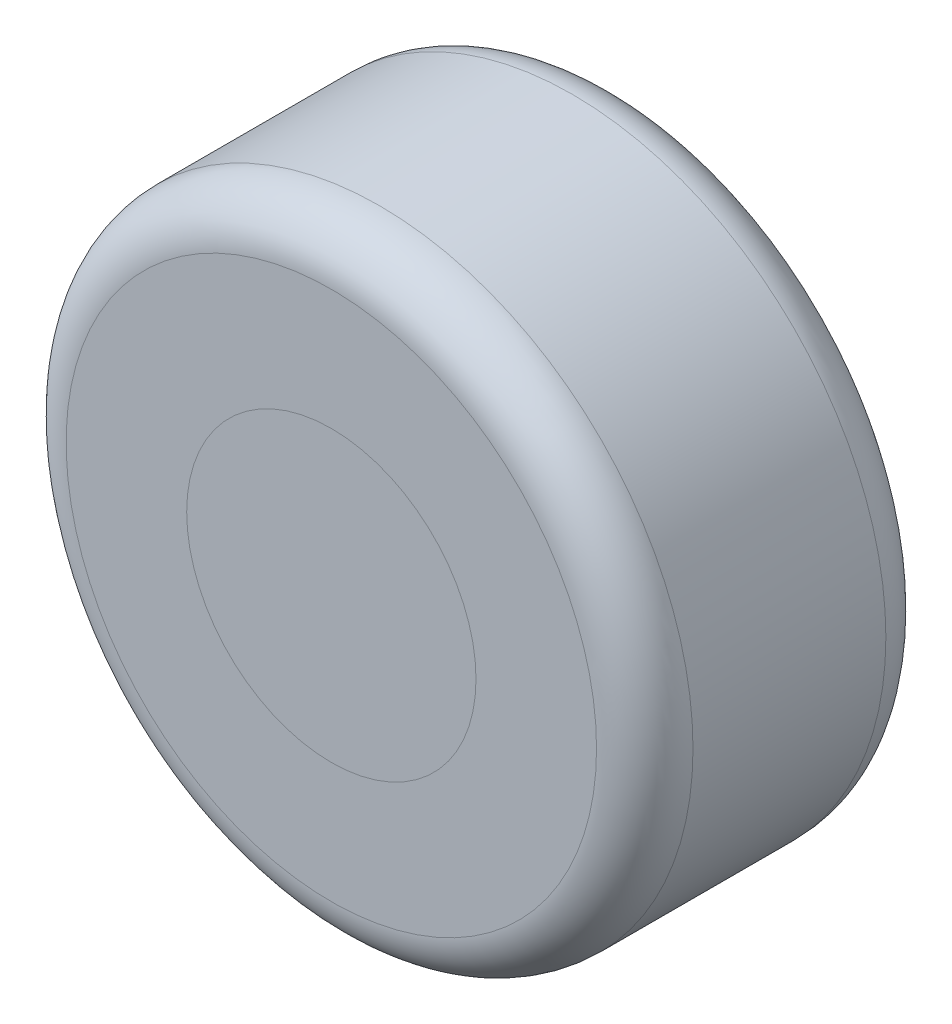
ISO-10303-21;
HEADER;
FILE_DESCRIPTION(('STEP AP214'),'2;1');
FILE_NAME('part.step','',(''),(''),'','','');
FILE_SCHEMA(('AUTOMOTIVE_DESIGN { 1 0 10303 214 1 1 1 1 }'));
ENDSEC;
DATA;
#1=APPLICATION_CONTEXT('core data for automotive mechanical design processes');
#2=APPLICATION_PROTOCOL_DEFINITION('international standard','automotive_design',2000,#1);
#3=PRODUCT_CONTEXT('',#1,'mechanical');
#4=PRODUCT('Part','Part','',(#3));
#5=PRODUCT_RELATED_PRODUCT_CATEGORY('part','',(#4));
#6=PRODUCT_DEFINITION_FORMATION('','',#4);
#7=PRODUCT_DEFINITION_CONTEXT('part definition',#1,'design');
#8=PRODUCT_DEFINITION('design','',#6,#7);
#9=PRODUCT_DEFINITION_SHAPE('','',#8);
#10=(LENGTH_UNIT() NAMED_UNIT(*) SI_UNIT(.MILLI.,.METRE.));
#11=(NAMED_UNIT(*) PLANE_ANGLE_UNIT() SI_UNIT($,.RADIAN.));
#12=(NAMED_UNIT(*) SI_UNIT($,.STERADIAN.) SOLID_ANGLE_UNIT());
#13=UNCERTAINTY_MEASURE_WITH_UNIT(LENGTH_MEASURE(1.E-05),#10,'distance_accuracy_value','');
#14=(GEOMETRIC_REPRESENTATION_CONTEXT(3) GLOBAL_UNCERTAINTY_ASSIGNED_CONTEXT((#13)) GLOBAL_UNIT_ASSIGNED_CONTEXT((#10,
#11,#12)) REPRESENTATION_CONTEXT('',''));
#15=CARTESIAN_POINT('',(0.,0.,0.));
#16=DIRECTION('',(0.,0.,1.));
#17=DIRECTION('',(1.,0.,0.));
#18=AXIS2_PLACEMENT_3D('',#15,#16,#17);
#19=CARTESIAN_POINT('',(0.,0.,-60.));
#20=DIRECTION('',(0.,0.,1.));
#21=DIRECTION('',(1.,0.,0.));
#22=AXIS2_PLACEMENT_3D('',#19,#20,#21);
#23=CYLINDRICAL_SURFACE('',#22,30.);
#24=CARTESIAN_POINT('',(0.,0.,-60.));
#25=DIRECTION('',(0.,0.,1.));
#26=DIRECTION('',(1.,0.,0.));
#27=AXIS2_PLACEMENT_3D('',#24,#25,#26);
#28=CIRCLE('',#27,30.);
#29=CARTESIAN_POINT('',(30.,0.,-60.));
#30=VERTEX_POINT('',#29);
#31=EDGE_CURVE('E11',#30,#30,#28,.T.);
#32=ORIENTED_EDGE('',*,*,#31,.T.);
#33=EDGE_LOOP('',(#32));
#34=FACE_BOUND('',#33,.T.);
#35=CARTESIAN_POINT('',(0.,0.,0.));
#36=DIRECTION('',(0.,0.,1.));
#37=DIRECTION('',(1.,0.,0.));
#38=AXIS2_PLACEMENT_3D('',#35,#36,#37);
#39=CIRCLE('',#38,30.);
#40=CARTESIAN_POINT('',(30.,0.,0.));
#41=VERTEX_POINT('',#40);
#42=EDGE_CURVE('E50',#41,#41,#39,.T.);
#43=ORIENTED_EDGE('',*,*,#42,.F.);
#44=EDGE_LOOP('',(#43));
#45=FACE_BOUND('',#44,.T.);
#46=ADVANCED_FACE('F47',(#34,#45),#23,.T.);
#47=CARTESIAN_POINT('',(0.,0.,-60.));
#48=DIRECTION('',(0.,0.,1.));
#49=DIRECTION('',(1.,0.,0.));
#50=AXIS2_PLACEMENT_3D('',#47,#48,#49);
#51=PLANE('',#50);
#52=ORIENTED_EDGE('',*,*,#31,.F.);
#53=EDGE_LOOP('',(#52));
#54=FACE_BOUND('',#53,.T.);
#55=ADVANCED_FACE('F62',(#54),#51,.F.);
#56=CARTESIAN_POINT('',(0.,0.,0.));
#57=DIRECTION('',(0.,0.,1.));
#58=DIRECTION('',(1.,0.,0.));
#59=AXIS2_PLACEMENT_3D('',#56,#57,#58);
#60=PLANE('',#59);
#61=ORIENTED_EDGE('',*,*,#42,.T.);
#62=EDGE_LOOP('',(#61));
#63=FACE_BOUND('',#62,.T.);
#64=ADVANCED_FACE('F59',(#63),#60,.T.);
#65=CLOSED_SHELL('',(#46,#55,#64));
#66=MANIFOLD_SOLID_BREP('B2',#65);
#67=CARTESIAN_POINT('',(0.,0.,-60.));
#68=DIRECTION('',(0.,0.,1.));
#69=DIRECTION('',(1.,0.,0.));
#70=AXIS2_PLACEMENT_3D('',#67,#68,#69);
#71=CYLINDRICAL_SURFACE('',#70,65.);
#72=CARTESIAN_POINT('',(0.,0.,-50.));
#73=DIRECTION('',(0.,0.,1.));
#74=DIRECTION('',(1.,0.,0.));
#75=AXIS2_PLACEMENT_3D('',#72,#73,#74);
#76=CIRCLE('',#75,65.);
#77=CARTESIAN_POINT('',(65.,0.,-50.));
#78=VERTEX_POINT('',#77);
#79=EDGE_CURVE('E105',#78,#78,#76,.T.);
#80=ORIENTED_EDGE('',*,*,#79,.T.);
#81=EDGE_LOOP('',(#80));
#82=FACE_BOUND('',#81,.T.);
#83=CARTESIAN_POINT('',(0.,0.,-10.));
#84=DIRECTION('',(0.,0.,1.));
#85=DIRECTION('',(1.,0.,0.));
#86=AXIS2_PLACEMENT_3D('',#83,#84,#85);
#87=CIRCLE('',#86,65.);
#88=CARTESIAN_POINT('',(65.,0.,-10.));
#89=VERTEX_POINT('',#88);
#90=EDGE_CURVE('E110',#89,#89,#87,.F.);
#91=ORIENTED_EDGE('',*,*,#90,.T.);
#92=EDGE_LOOP('',(#91));
#93=FACE_BOUND('',#92,.T.);
#94=ADVANCED_FACE('F92',(#82,#93),#71,.T.);
#95=CARTESIAN_POINT('',(0.,0.,-60.));
#96=DIRECTION('',(0.,0.,1.));
#97=DIRECTION('',(1.,0.,0.));
#98=AXIS2_PLACEMENT_3D('',#95,#96,#97);
#99=PLANE('',#98);
#100=CARTESIAN_POINT('',(0.,0.,-60.));
#101=DIRECTION('',(0.,0.,1.));
#102=DIRECTION('',(1.,0.,0.));
#103=AXIS2_PLACEMENT_3D('',#100,#101,#102);
#104=CIRCLE('',#103,55.);
#105=CARTESIAN_POINT('',(55.,0.,-60.));
#106=VERTEX_POINT('',#105);
#107=EDGE_CURVE('E100',#106,#106,#104,.F.);
#108=ORIENTED_EDGE('',*,*,#107,.T.);
#109=EDGE_LOOP('',(#108));
#110=FACE_BOUND('',#109,.T.);
#111=CARTESIAN_POINT('',(0.,0.,-60.));
#112=DIRECTION('',(0.,0.,1.));
#113=DIRECTION('',(1.,0.,0.));
#114=AXIS2_PLACEMENT_3D('',#111,#112,#113);
#115=CIRCLE('',#114,30.);
#116=CARTESIAN_POINT('',(30.,0.,-60.));
#117=VERTEX_POINT('',#116);
#118=EDGE_CURVE('E116',#117,#117,#115,.T.);
#119=ORIENTED_EDGE('',*,*,#118,.T.);
#120=EDGE_LOOP('',(#119));
#121=FACE_BOUND('',#120,.T.);
#122=ADVANCED_FACE('F125',(#110,#121),#99,.F.);
#123=CARTESIAN_POINT('',(0.,0.,0.));
#124=DIRECTION('',(0.,0.,1.));
#125=DIRECTION('',(1.,0.,0.));
#126=AXIS2_PLACEMENT_3D('',#123,#124,#125);
#127=PLANE('',#126);
#128=CARTESIAN_POINT('',(0.,0.,0.));
#129=DIRECTION('',(0.,0.,1.));
#130=DIRECTION('',(1.,0.,0.));
#131=AXIS2_PLACEMENT_3D('',#128,#129,#130);
#132=CIRCLE('',#131,55.);
#133=CARTESIAN_POINT('',(55.,0.,0.));
#134=VERTEX_POINT('',#133);
#135=EDGE_CURVE('E46',#134,#134,#132,.T.);
#136=ORIENTED_EDGE('',*,*,#135,.T.);
#137=EDGE_LOOP('',(#136));
#138=FACE_BOUND('',#137,.T.);
#139=CARTESIAN_POINT('',(0.,0.,0.));
#140=DIRECTION('',(0.,0.,1.));
#141=DIRECTION('',(1.,0.,0.));
#142=AXIS2_PLACEMENT_3D('',#139,#140,#141);
#143=CIRCLE('',#142,30.);
#144=CARTESIAN_POINT('',(30.,0.,0.));
#145=VERTEX_POINT('',#144);
#146=EDGE_CURVE('E117',#145,#145,#143,.T.);
#147=ORIENTED_EDGE('',*,*,#146,.F.);
#148=EDGE_LOOP('',(#147));
#149=FACE_BOUND('',#148,.T.);
#150=ADVANCED_FACE('F131',(#138,#149),#127,.T.);
#151=CARTESIAN_POINT('',(0.,0.,-60.));
#152=DIRECTION('',(0.,0.,1.));
#153=DIRECTION('',(1.,0.,0.));
#154=AXIS2_PLACEMENT_3D('',#151,#152,#153);
#155=CYLINDRICAL_SURFACE('',#154,30.);
#156=ORIENTED_EDGE('',*,*,#118,.F.);
#157=EDGE_LOOP('',(#156));
#158=FACE_BOUND('',#157,.T.);
#159=ORIENTED_EDGE('',*,*,#146,.T.);
#160=EDGE_LOOP('',(#159));
#161=FACE_BOUND('',#160,.T.);
#162=ADVANCED_FACE('F127',(#158,#161),#155,.F.);
#163=CARTESIAN_POINT('',(0.,0.,-50.));
#164=DIRECTION('',(0.,0.,1.));
#165=DIRECTION('',(1.,0.,0.));
#166=AXIS2_PLACEMENT_3D('',#163,#164,#165);
#167=TOROIDAL_SURFACE('',#166,55.,10.);
#168=ORIENTED_EDGE('',*,*,#107,.F.);
#169=EDGE_LOOP('',(#168));
#170=FACE_BOUND('',#169,.T.);
#171=ORIENTED_EDGE('',*,*,#79,.F.);
#172=EDGE_LOOP('',(#171));
#173=FACE_BOUND('',#172,.T.);
#174=ADVANCED_FACE('F130',(#170,#173),#167,.T.);
#175=CARTESIAN_POINT('',(0.,0.,-10.));
#176=DIRECTION('',(0.,0.,1.));
#177=DIRECTION('',(1.,0.,0.));
#178=AXIS2_PLACEMENT_3D('',#175,#176,#177);
#179=TOROIDAL_SURFACE('',#178,55.,10.);
#180=ORIENTED_EDGE('',*,*,#90,.F.);
#181=EDGE_LOOP('',(#180));
#182=FACE_BOUND('',#181,.T.);
#183=ORIENTED_EDGE('',*,*,#135,.F.);
#184=EDGE_LOOP('',(#183));
#185=FACE_BOUND('',#184,.T.);
#186=ADVANCED_FACE('F94',(#182,#185),#179,.T.);
#187=CLOSED_SHELL('',(#94,#122,#150,#162,#174,#186));
#188=MANIFOLD_SOLID_BREP('B6',#187);
#189=ADVANCED_BREP_SHAPE_REPRESENTATION('',(#18,#66,#188),#14);
#190=SHAPE_DEFINITION_REPRESENTATION(#9,#189);
ENDSEC;
END-ISO-10303-21;
